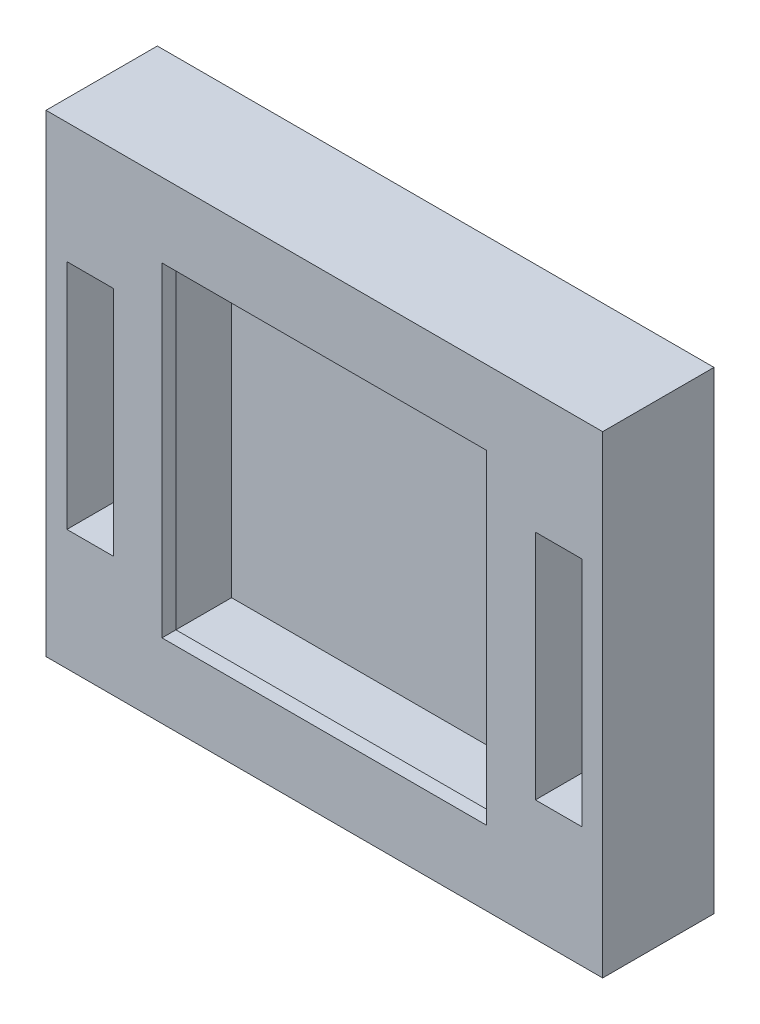
ISO-10303-21;
HEADER;
FILE_DESCRIPTION(('STEP AP214'),'2;1');
FILE_NAME('part.step','',(''),(''),'','','');
FILE_SCHEMA(('AUTOMOTIVE_DESIGN { 1 0 10303 214 1 1 1 1 }'));
ENDSEC;
DATA;
#1=APPLICATION_CONTEXT('core data for automotive mechanical design processes');
#2=APPLICATION_PROTOCOL_DEFINITION('international standard','automotive_design',2000,#1);
#3=PRODUCT_CONTEXT('',#1,'mechanical');
#4=PRODUCT('Part','Part','',(#3));
#5=PRODUCT_RELATED_PRODUCT_CATEGORY('part','',(#4));
#6=PRODUCT_DEFINITION_FORMATION('','',#4);
#7=PRODUCT_DEFINITION_CONTEXT('part definition',#1,'design');
#8=PRODUCT_DEFINITION('design','',#6,#7);
#9=PRODUCT_DEFINITION_SHAPE('','',#8);
#10=(LENGTH_UNIT() NAMED_UNIT(*) SI_UNIT(.MILLI.,.METRE.));
#11=(NAMED_UNIT(*) PLANE_ANGLE_UNIT() SI_UNIT($,.RADIAN.));
#12=(NAMED_UNIT(*) SI_UNIT($,.STERADIAN.) SOLID_ANGLE_UNIT());
#13=UNCERTAINTY_MEASURE_WITH_UNIT(LENGTH_MEASURE(1.E-05),#10,'distance_accuracy_value','');
#14=(GEOMETRIC_REPRESENTATION_CONTEXT(3) GLOBAL_UNCERTAINTY_ASSIGNED_CONTEXT((#13)) GLOBAL_UNIT_ASSIGNED_CONTEXT((#10,
#11,#12)) REPRESENTATION_CONTEXT('',''));
#15=CARTESIAN_POINT('',(0.,0.,0.));
#16=DIRECTION('',(0.,0.,1.));
#17=DIRECTION('',(1.,0.,0.));
#18=AXIS2_PLACEMENT_3D('',#15,#16,#17);
#19=CARTESIAN_POINT('',(15.24,-12.954,5.334));
#20=DIRECTION('',(-1.,0.,0.));
#21=DIRECTION('',(0.,0.,1.));
#22=AXIS2_PLACEMENT_3D('',#19,#20,#21);
#23=PLANE('',#22);
#24=DIRECTION('',(0.,1.,0.));
#25=VECTOR('',#24,1.);
#26=CARTESIAN_POINT('',(15.24,-12.954,0.));
#27=LINE('',#26,#25);
#28=CARTESIAN_POINT('',(15.24,-12.954,0.));
#29=VERTEX_POINT('',#28);
#30=CARTESIAN_POINT('',(15.24,12.954,0.));
#31=VERTEX_POINT('',#30);
#32=EDGE_CURVE('E310',#29,#31,#27,.T.);
#33=ORIENTED_EDGE('',*,*,#32,.T.);
#34=DIRECTION('',(0.,0.,-1.));
#35=VECTOR('',#34,1.);
#36=CARTESIAN_POINT('',(15.24,12.954,5.334));
#37=LINE('',#36,#35);
#38=CARTESIAN_POINT('',(15.24,12.954,6.096));
#39=VERTEX_POINT('',#38);
#40=EDGE_CURVE('E11',#39,#31,#37,.T.);
#41=ORIENTED_EDGE('',*,*,#40,.F.);
#42=DIRECTION('',(0.,1.,0.));
#43=VECTOR('',#42,1.);
#44=CARTESIAN_POINT('',(15.24,12.954,6.096));
#45=LINE('',#44,#43);
#46=CARTESIAN_POINT('',(15.24,-12.954,6.096));
#47=VERTEX_POINT('',#46);
#48=EDGE_CURVE('E276',#47,#39,#45,.T.);
#49=ORIENTED_EDGE('',*,*,#48,.F.);
#50=DIRECTION('',(0.,0.,-1.));
#51=VECTOR('',#50,1.);
#52=CARTESIAN_POINT('',(15.24,-12.954,5.334));
#53=LINE('',#52,#51);
#54=EDGE_CURVE('E327',#47,#29,#53,.T.);
#55=ORIENTED_EDGE('',*,*,#54,.T.);
#56=EDGE_LOOP('',(#33,#41,#49,#55));
#57=FACE_BOUND('',#56,.T.);
#58=ADVANCED_FACE('F33',(#57),#23,.F.);
#59=CARTESIAN_POINT('',(-15.24,12.954,5.334));
#60=DIRECTION('',(0.,-1.,0.));
#61=DIRECTION('',(0.,0.,-1.));
#62=AXIS2_PLACEMENT_3D('',#59,#60,#61);
#63=PLANE('',#62);
#64=DIRECTION('',(-1.,0.,0.));
#65=VECTOR('',#64,1.);
#66=CARTESIAN_POINT('',(-15.24,12.954,0.));
#67=LINE('',#66,#65);
#68=CARTESIAN_POINT('',(-15.24,12.954,0.));
#69=VERTEX_POINT('',#68);
#70=EDGE_CURVE('E321',#31,#69,#67,.T.);
#71=ORIENTED_EDGE('',*,*,#70,.T.);
#72=DIRECTION('',(0.,0.,-1.));
#73=VECTOR('',#72,1.);
#74=CARTESIAN_POINT('',(-15.24,12.954,5.334));
#75=LINE('',#74,#73);
#76=CARTESIAN_POINT('',(-15.24,12.954,6.096));
#77=VERTEX_POINT('',#76);
#78=EDGE_CURVE('E40',#77,#69,#75,.T.);
#79=ORIENTED_EDGE('',*,*,#78,.F.);
#80=DIRECTION('',(-1.,0.,0.));
#81=VECTOR('',#80,1.);
#82=CARTESIAN_POINT('',(-15.24,12.954,6.096));
#83=LINE('',#82,#81);
#84=EDGE_CURVE('E279',#39,#77,#83,.T.);
#85=ORIENTED_EDGE('',*,*,#84,.F.);
#86=ORIENTED_EDGE('',*,*,#40,.T.);
#87=EDGE_LOOP('',(#71,#79,#85,#86));
#88=FACE_BOUND('',#87,.T.);
#89=ADVANCED_FACE('F350',(#88),#63,.F.);
#90=CARTESIAN_POINT('',(-15.24,-12.954,5.334));
#91=DIRECTION('',(1.,0.,0.));
#92=DIRECTION('',(0.,0.,-1.));
#93=AXIS2_PLACEMENT_3D('',#90,#91,#92);
#94=PLANE('',#93);
#95=DIRECTION('',(0.,-1.,0.));
#96=VECTOR('',#95,1.);
#97=CARTESIAN_POINT('',(-15.24,-12.954,0.));
#98=LINE('',#97,#96);
#99=CARTESIAN_POINT('',(-15.24,-12.954,0.));
#100=VERTEX_POINT('',#99);
#101=EDGE_CURVE('E323',#69,#100,#98,.T.);
#102=ORIENTED_EDGE('',*,*,#101,.T.);
#103=DIRECTION('',(0.,0.,-1.));
#104=VECTOR('',#103,1.);
#105=CARTESIAN_POINT('',(-15.24,-12.954,5.334));
#106=LINE('',#105,#104);
#107=CARTESIAN_POINT('',(-15.24,-12.954,6.096));
#108=VERTEX_POINT('',#107);
#109=EDGE_CURVE('E330',#108,#100,#106,.T.);
#110=ORIENTED_EDGE('',*,*,#109,.F.);
#111=DIRECTION('',(0.,-1.,0.));
#112=VECTOR('',#111,1.);
#113=CARTESIAN_POINT('',(-15.24,12.954,6.096));
#114=LINE('',#113,#112);
#115=EDGE_CURVE('E270',#77,#108,#114,.T.);
#116=ORIENTED_EDGE('',*,*,#115,.F.);
#117=ORIENTED_EDGE('',*,*,#78,.T.);
#118=EDGE_LOOP('',(#102,#110,#116,#117));
#119=FACE_BOUND('',#118,.T.);
#120=ADVANCED_FACE('F336',(#119),#94,.F.);
#121=CARTESIAN_POINT('',(-15.24,-12.954,5.334));
#122=DIRECTION('',(0.,1.,0.));
#123=DIRECTION('',(0.,0.,1.));
#124=AXIS2_PLACEMENT_3D('',#121,#122,#123);
#125=PLANE('',#124);
#126=DIRECTION('',(1.,0.,0.));
#127=VECTOR('',#126,1.);
#128=CARTESIAN_POINT('',(-15.24,-12.954,0.));
#129=LINE('',#128,#127);
#130=EDGE_CURVE('E325',#100,#29,#129,.T.);
#131=ORIENTED_EDGE('',*,*,#130,.T.);
#132=ORIENTED_EDGE('',*,*,#54,.F.);
#133=DIRECTION('',(1.,0.,0.));
#134=VECTOR('',#133,1.);
#135=CARTESIAN_POINT('',(-15.24,-12.954,6.096));
#136=LINE('',#135,#134);
#137=EDGE_CURVE('E273',#108,#47,#136,.T.);
#138=ORIENTED_EDGE('',*,*,#137,.F.);
#139=ORIENTED_EDGE('',*,*,#109,.T.);
#140=EDGE_LOOP('',(#131,#132,#138,#139));
#141=FACE_BOUND('',#140,.T.);
#142=ADVANCED_FACE('F343',(#141),#125,.F.);
#143=CARTESIAN_POINT('',(0.,0.,0.));
#144=DIRECTION('',(0.,0.,-1.));
#145=DIRECTION('',(-1.,0.,0.));
#146=AXIS2_PLACEMENT_3D('',#143,#144,#145);
#147=PLANE('',#146);
#148=DIRECTION('',(0.,-1.,0.));
#149=VECTOR('',#148,1.);
#150=CARTESIAN_POINT('',(-14.097,-6.35,0.));
#151=LINE('',#150,#149);
#152=CARTESIAN_POINT('',(-14.097,6.35,0.));
#153=VERTEX_POINT('',#152);
#154=CARTESIAN_POINT('',(-14.097,-6.35,0.));
#155=VERTEX_POINT('',#154);
#156=EDGE_CURVE('E173',#153,#155,#151,.T.);
#157=ORIENTED_EDGE('',*,*,#156,.T.);
#158=DIRECTION('',(1.,0.,0.));
#159=VECTOR('',#158,1.);
#160=CARTESIAN_POINT('',(-11.557,-6.35,0.));
#161=LINE('',#160,#159);
#162=CARTESIAN_POINT('',(-11.557,-6.35,0.));
#163=VERTEX_POINT('',#162);
#164=EDGE_CURVE('E184',#155,#163,#161,.T.);
#165=ORIENTED_EDGE('',*,*,#164,.T.);
#166=DIRECTION('',(0.,1.,0.));
#167=VECTOR('',#166,1.);
#168=CARTESIAN_POINT('',(-11.557,-6.35,0.));
#169=LINE('',#168,#167);
#170=CARTESIAN_POINT('',(-11.557,6.35,0.));
#171=VERTEX_POINT('',#170);
#172=EDGE_CURVE('E47',#163,#171,#169,.T.);
#173=ORIENTED_EDGE('',*,*,#172,.T.);
#174=DIRECTION('',(-1.,0.,0.));
#175=VECTOR('',#174,1.);
#176=CARTESIAN_POINT('',(-11.557,6.35,0.));
#177=LINE('',#176,#175);
#178=EDGE_CURVE('E181',#171,#153,#177,.T.);
#179=ORIENTED_EDGE('',*,*,#178,.T.);
#180=EDGE_LOOP('',(#157,#165,#173,#179));
#181=FACE_BOUND('',#180,.T.);
#182=DIRECTION('',(0.,-1.,0.));
#183=VECTOR('',#182,1.);
#184=CARTESIAN_POINT('',(11.557,-6.35,0.));
#185=LINE('',#184,#183);
#186=CARTESIAN_POINT('',(11.557,6.35,0.));
#187=VERTEX_POINT('',#186);
#188=CARTESIAN_POINT('',(11.557,-6.35,0.));
#189=VERTEX_POINT('',#188);
#190=EDGE_CURVE('E211',#187,#189,#185,.T.);
#191=ORIENTED_EDGE('',*,*,#190,.T.);
#192=DIRECTION('',(1.,0.,0.));
#193=VECTOR('',#192,1.);
#194=CARTESIAN_POINT('',(11.557,-6.35,0.));
#195=LINE('',#194,#193);
#196=CARTESIAN_POINT('',(14.097,-6.35,0.));
#197=VERTEX_POINT('',#196);
#198=EDGE_CURVE('E214',#189,#197,#195,.T.);
#199=ORIENTED_EDGE('',*,*,#198,.T.);
#200=DIRECTION('',(0.,1.,0.));
#201=VECTOR('',#200,1.);
#202=CARTESIAN_POINT('',(14.097,-6.35,0.));
#203=LINE('',#202,#201);
#204=CARTESIAN_POINT('',(14.097,6.35,0.));
#205=VERTEX_POINT('',#204);
#206=EDGE_CURVE('E55',#197,#205,#203,.T.);
#207=ORIENTED_EDGE('',*,*,#206,.T.);
#208=DIRECTION('',(-1.,0.,0.));
#209=VECTOR('',#208,1.);
#210=CARTESIAN_POINT('',(11.557,6.35,0.));
#211=LINE('',#210,#209);
#212=EDGE_CURVE('E219',#205,#187,#211,.T.);
#213=ORIENTED_EDGE('',*,*,#212,.T.);
#214=EDGE_LOOP('',(#191,#199,#207,#213));
#215=FACE_BOUND('',#214,.T.);
#216=ORIENTED_EDGE('',*,*,#32,.F.);
#217=ORIENTED_EDGE('',*,*,#130,.F.);
#218=ORIENTED_EDGE('',*,*,#101,.F.);
#219=ORIENTED_EDGE('',*,*,#70,.F.);
#220=EDGE_LOOP('',(#216,#217,#218,#219));
#221=FACE_BOUND('',#220,.T.);
#222=ADVANCED_FACE('F188',(#181,#215,#221),#147,.T.);
#223=CARTESIAN_POINT('',(0.,0.,6.096));
#224=DIRECTION('',(0.,0.,1.));
#225=DIRECTION('',(1.,0.,0.));
#226=AXIS2_PLACEMENT_3D('',#223,#224,#225);
#227=PLANE('',#226);
#228=DIRECTION('',(0.,-1.,0.));
#229=VECTOR('',#228,1.);
#230=CARTESIAN_POINT('',(-14.097,-6.35,6.096));
#231=LINE('',#230,#229);
#232=CARTESIAN_POINT('',(-14.097,6.35,6.096));
#233=VERTEX_POINT('',#232);
#234=CARTESIAN_POINT('',(-14.097,-6.35,6.096));
#235=VERTEX_POINT('',#234);
#236=EDGE_CURVE('E176',#233,#235,#231,.T.);
#237=ORIENTED_EDGE('',*,*,#236,.F.);
#238=DIRECTION('',(-1.,0.,0.));
#239=VECTOR('',#238,1.);
#240=CARTESIAN_POINT('',(-11.557,6.35,6.096));
#241=LINE('',#240,#239);
#242=CARTESIAN_POINT('',(-11.557,6.35,6.096));
#243=VERTEX_POINT('',#242);
#244=EDGE_CURVE('E191',#243,#233,#241,.T.);
#245=ORIENTED_EDGE('',*,*,#244,.F.);
#246=DIRECTION('',(0.,1.,0.));
#247=VECTOR('',#246,1.);
#248=CARTESIAN_POINT('',(-11.557,-6.35,6.096));
#249=LINE('',#248,#247);
#250=CARTESIAN_POINT('',(-11.557,-6.35,6.096));
#251=VERTEX_POINT('',#250);
#252=EDGE_CURVE('E194',#251,#243,#249,.T.);
#253=ORIENTED_EDGE('',*,*,#252,.F.);
#254=DIRECTION('',(1.,0.,0.));
#255=VECTOR('',#254,1.);
#256=CARTESIAN_POINT('',(-11.557,-6.35,6.096));
#257=LINE('',#256,#255);
#258=EDGE_CURVE('E200',#235,#251,#257,.T.);
#259=ORIENTED_EDGE('',*,*,#258,.F.);
#260=EDGE_LOOP('',(#237,#245,#253,#259));
#261=FACE_BOUND('',#260,.T.);
#262=DIRECTION('',(0.,-1.,0.));
#263=VECTOR('',#262,1.);
#264=CARTESIAN_POINT('',(11.557,-6.35,6.096));
#265=LINE('',#264,#263);
#266=CARTESIAN_POINT('',(11.557,6.35,6.096));
#267=VERTEX_POINT('',#266);
#268=CARTESIAN_POINT('',(11.557,-6.35,6.096));
#269=VERTEX_POINT('',#268);
#270=EDGE_CURVE('E223',#267,#269,#265,.T.);
#271=ORIENTED_EDGE('',*,*,#270,.F.);
#272=DIRECTION('',(-1.,0.,0.));
#273=VECTOR('',#272,1.);
#274=CARTESIAN_POINT('',(11.557,6.35,6.096));
#275=LINE('',#274,#273);
#276=CARTESIAN_POINT('',(14.097,6.35,6.096));
#277=VERTEX_POINT('',#276);
#278=EDGE_CURVE('E215',#277,#267,#275,.T.);
#279=ORIENTED_EDGE('',*,*,#278,.F.);
#280=DIRECTION('',(0.,1.,0.));
#281=VECTOR('',#280,1.);
#282=CARTESIAN_POINT('',(14.097,-6.35,6.096));
#283=LINE('',#282,#281);
#284=CARTESIAN_POINT('',(14.097,-6.35,6.096));
#285=VERTEX_POINT('',#284);
#286=EDGE_CURVE('E228',#285,#277,#283,.T.);
#287=ORIENTED_EDGE('',*,*,#286,.F.);
#288=DIRECTION('',(1.,0.,0.));
#289=VECTOR('',#288,1.);
#290=CARTESIAN_POINT('',(11.557,-6.35,6.096));
#291=LINE('',#290,#289);
#292=EDGE_CURVE('E225',#269,#285,#291,.T.);
#293=ORIENTED_EDGE('',*,*,#292,.F.);
#294=EDGE_LOOP('',(#271,#279,#287,#293));
#295=FACE_BOUND('',#294,.T.);
#296=ORIENTED_EDGE('',*,*,#115,.T.);
#297=ORIENTED_EDGE('',*,*,#137,.T.);
#298=ORIENTED_EDGE('',*,*,#48,.T.);
#299=ORIENTED_EDGE('',*,*,#84,.T.);
#300=EDGE_LOOP('',(#296,#297,#298,#299));
#301=FACE_BOUND('',#300,.T.);
#302=DIRECTION('',(1.,0.,0.));
#303=VECTOR('',#302,1.);
#304=CARTESIAN_POINT('',(8.89,-8.89,6.096));
#305=LINE('',#304,#303);
#306=CARTESIAN_POINT('',(-8.89,-8.89,6.096));
#307=VERTEX_POINT('',#306);
#308=CARTESIAN_POINT('',(8.89,-8.89,6.096));
#309=VERTEX_POINT('',#308);
#310=EDGE_CURVE('E242',#307,#309,#305,.T.);
#311=ORIENTED_EDGE('',*,*,#310,.F.);
#312=DIRECTION('',(0.,-1.,0.));
#313=VECTOR('',#312,1.);
#314=CARTESIAN_POINT('',(-8.89,-8.89,6.096));
#315=LINE('',#314,#313);
#316=CARTESIAN_POINT('',(-8.89,8.89,6.096));
#317=VERTEX_POINT('',#316);
#318=EDGE_CURVE('E240',#317,#307,#315,.T.);
#319=ORIENTED_EDGE('',*,*,#318,.F.);
#320=DIRECTION('',(-1.,0.,0.));
#321=VECTOR('',#320,1.);
#322=CARTESIAN_POINT('',(8.89,8.89,6.096));
#323=LINE('',#322,#321);
#324=CARTESIAN_POINT('',(8.89,8.89,6.096));
#325=VERTEX_POINT('',#324);
#326=EDGE_CURVE('E248',#325,#317,#323,.T.);
#327=ORIENTED_EDGE('',*,*,#326,.F.);
#328=DIRECTION('',(0.,1.,0.));
#329=VECTOR('',#328,1.);
#330=CARTESIAN_POINT('',(8.89,-8.89,6.096));
#331=LINE('',#330,#329);
#332=EDGE_CURVE('E245',#309,#325,#331,.T.);
#333=ORIENTED_EDGE('',*,*,#332,.F.);
#334=EDGE_LOOP('',(#311,#319,#327,#333));
#335=FACE_BOUND('',#334,.T.);
#336=ADVANCED_FACE('F348',(#261,#295,#301,#335),#227,.T.);
#337=CARTESIAN_POINT('',(0.,0.,5.334));
#338=DIRECTION('',(0.,0.,1.));
#339=DIRECTION('',(1.,0.,0.));
#340=AXIS2_PLACEMENT_3D('',#337,#338,#339);
#341=PLANE('',#340);
#342=DIRECTION('',(-1.,0.,0.));
#343=VECTOR('',#342,1.);
#344=CARTESIAN_POINT('',(-10.414,10.414,5.334));
#345=LINE('',#344,#343);
#346=CARTESIAN_POINT('',(10.414,10.414,5.334));
#347=VERTEX_POINT('',#346);
#348=CARTESIAN_POINT('',(-10.414,10.414,5.334));
#349=VERTEX_POINT('',#348);
#350=EDGE_CURVE('E299',#347,#349,#345,.T.);
#351=ORIENTED_EDGE('',*,*,#350,.F.);
#352=DIRECTION('',(0.,1.,0.));
#353=VECTOR('',#352,1.);
#354=CARTESIAN_POINT('',(10.414,-10.414,5.334));
#355=LINE('',#354,#353);
#356=CARTESIAN_POINT('',(10.414,-10.414,5.334));
#357=VERTEX_POINT('',#356);
#358=EDGE_CURVE('E282',#357,#347,#355,.T.);
#359=ORIENTED_EDGE('',*,*,#358,.F.);
#360=DIRECTION('',(1.,0.,0.));
#361=VECTOR('',#360,1.);
#362=CARTESIAN_POINT('',(-10.414,-10.414,5.334));
#363=LINE('',#362,#361);
#364=CARTESIAN_POINT('',(-10.414,-10.414,5.334));
#365=VERTEX_POINT('',#364);
#366=EDGE_CURVE('E287',#365,#357,#363,.T.);
#367=ORIENTED_EDGE('',*,*,#366,.F.);
#368=DIRECTION('',(0.,-1.,0.));
#369=VECTOR('',#368,1.);
#370=CARTESIAN_POINT('',(-10.414,-10.414,5.334));
#371=LINE('',#370,#369);
#372=EDGE_CURVE('E302',#349,#365,#371,.T.);
#373=ORIENTED_EDGE('',*,*,#372,.F.);
#374=EDGE_LOOP('',(#351,#359,#367,#373));
#375=FACE_BOUND('',#374,.T.);
#376=DIRECTION('',(0.,-1.,0.));
#377=VECTOR('',#376,1.);
#378=CARTESIAN_POINT('',(-8.89,-8.89,5.334));
#379=LINE('',#378,#377);
#380=CARTESIAN_POINT('',(-8.89,8.89,5.334));
#381=VERTEX_POINT('',#380);
#382=CARTESIAN_POINT('',(-8.89,-8.89,5.334));
#383=VERTEX_POINT('',#382);
#384=EDGE_CURVE('E207',#381,#383,#379,.T.);
#385=ORIENTED_EDGE('',*,*,#384,.T.);
#386=DIRECTION('',(1.,0.,0.));
#387=VECTOR('',#386,1.);
#388=CARTESIAN_POINT('',(8.89,-8.89,5.334));
#389=LINE('',#388,#387);
#390=CARTESIAN_POINT('',(8.89,-8.89,5.334));
#391=VERTEX_POINT('',#390);
#392=EDGE_CURVE('E253',#383,#391,#389,.T.);
#393=ORIENTED_EDGE('',*,*,#392,.T.);
#394=DIRECTION('',(0.,1.,0.));
#395=VECTOR('',#394,1.);
#396=CARTESIAN_POINT('',(8.89,-8.89,5.334));
#397=LINE('',#396,#395);
#398=CARTESIAN_POINT('',(8.89,8.89,5.334));
#399=VERTEX_POINT('',#398);
#400=EDGE_CURVE('E256',#391,#399,#397,.T.);
#401=ORIENTED_EDGE('',*,*,#400,.T.);
#402=DIRECTION('',(-1.,0.,0.));
#403=VECTOR('',#402,1.);
#404=CARTESIAN_POINT('',(8.89,8.89,5.334));
#405=LINE('',#404,#403);
#406=EDGE_CURVE('E243',#399,#381,#405,.T.);
#407=ORIENTED_EDGE('',*,*,#406,.T.);
#408=EDGE_LOOP('',(#385,#393,#401,#407));
#409=FACE_BOUND('',#408,.T.);
#410=ADVANCED_FACE('F384',(#375,#409),#341,.F.);
#411=CARTESIAN_POINT('',(-8.89,-8.89,6.096));
#412=DIRECTION('',(1.,0.,0.));
#413=DIRECTION('',(0.,0.,-1.));
#414=AXIS2_PLACEMENT_3D('',#411,#412,#413);
#415=PLANE('',#414);
#416=ORIENTED_EDGE('',*,*,#384,.F.);
#417=DIRECTION('',(0.,0.,-1.));
#418=VECTOR('',#417,1.);
#419=CARTESIAN_POINT('',(-8.89,8.89,6.096));
#420=LINE('',#419,#418);
#421=EDGE_CURVE('E250',#317,#381,#420,.T.);
#422=ORIENTED_EDGE('',*,*,#421,.F.);
#423=ORIENTED_EDGE('',*,*,#318,.T.);
#424=DIRECTION('',(0.,0.,-1.));
#425=VECTOR('',#424,1.);
#426=CARTESIAN_POINT('',(-8.89,-8.89,6.096));
#427=LINE('',#426,#425);
#428=EDGE_CURVE('E267',#307,#383,#427,.T.);
#429=ORIENTED_EDGE('',*,*,#428,.T.);
#430=EDGE_LOOP('',(#416,#422,#423,#429));
#431=FACE_BOUND('',#430,.T.);
#432=ADVANCED_FACE('F387',(#431),#415,.T.);
#433=CARTESIAN_POINT('',(8.89,-8.89,6.096));
#434=DIRECTION('',(0.,1.,0.));
#435=DIRECTION('',(-1.,0.,0.));
#436=AXIS2_PLACEMENT_3D('',#433,#434,#435);
#437=PLANE('',#436);
#438=ORIENTED_EDGE('',*,*,#392,.F.);
#439=ORIENTED_EDGE('',*,*,#428,.F.);
#440=ORIENTED_EDGE('',*,*,#310,.T.);
#441=DIRECTION('',(0.,0.,-1.));
#442=VECTOR('',#441,1.);
#443=CARTESIAN_POINT('',(8.89,-8.89,6.096));
#444=LINE('',#443,#442);
#445=EDGE_CURVE('E265',#309,#391,#444,.T.);
#446=ORIENTED_EDGE('',*,*,#445,.T.);
#447=EDGE_LOOP('',(#438,#439,#440,#446));
#448=FACE_BOUND('',#447,.T.);
#449=ADVANCED_FACE('F394',(#448),#437,.T.);
#450=CARTESIAN_POINT('',(8.89,-8.89,6.096));
#451=DIRECTION('',(-1.,0.,0.));
#452=DIRECTION('',(0.,0.,1.));
#453=AXIS2_PLACEMENT_3D('',#450,#451,#452);
#454=PLANE('',#453);
#455=ORIENTED_EDGE('',*,*,#400,.F.);
#456=ORIENTED_EDGE('',*,*,#445,.F.);
#457=ORIENTED_EDGE('',*,*,#332,.T.);
#458=DIRECTION('',(0.,0.,-1.));
#459=VECTOR('',#458,1.);
#460=CARTESIAN_POINT('',(8.89,8.89,6.096));
#461=LINE('',#460,#459);
#462=EDGE_CURVE('E263',#325,#399,#461,.T.);
#463=ORIENTED_EDGE('',*,*,#462,.T.);
#464=EDGE_LOOP('',(#455,#456,#457,#463));
#465=FACE_BOUND('',#464,.T.);
#466=ADVANCED_FACE('F398',(#465),#454,.T.);
#467=CARTESIAN_POINT('',(8.89,8.89,6.096));
#468=DIRECTION('',(0.,-1.,0.));
#469=DIRECTION('',(1.,0.,0.));
#470=AXIS2_PLACEMENT_3D('',#467,#468,#469);
#471=PLANE('',#470);
#472=ORIENTED_EDGE('',*,*,#406,.F.);
#473=ORIENTED_EDGE('',*,*,#462,.F.);
#474=ORIENTED_EDGE('',*,*,#326,.T.);
#475=ORIENTED_EDGE('',*,*,#421,.T.);
#476=EDGE_LOOP('',(#472,#473,#474,#475));
#477=FACE_BOUND('',#476,.T.);
#478=ADVANCED_FACE('F382',(#477),#471,.T.);
#479=CARTESIAN_POINT('',(0.,0.,0.762));
#480=DIRECTION('',(0.,0.,-1.));
#481=DIRECTION('',(-1.,0.,0.));
#482=AXIS2_PLACEMENT_3D('',#479,#480,#481);
#483=PLANE('',#482);
#484=DIRECTION('',(0.,1.,0.));
#485=VECTOR('',#484,1.);
#486=CARTESIAN_POINT('',(10.414,-10.414,0.762));
#487=LINE('',#486,#485);
#488=CARTESIAN_POINT('',(10.414,-10.414,0.762));
#489=VERTEX_POINT('',#488);
#490=CARTESIAN_POINT('',(10.414,10.414,0.762));
#491=VERTEX_POINT('',#490);
#492=EDGE_CURVE('E283',#489,#491,#487,.T.);
#493=ORIENTED_EDGE('',*,*,#492,.T.);
#494=DIRECTION('',(-1.,0.,0.));
#495=VECTOR('',#494,1.);
#496=CARTESIAN_POINT('',(-10.414,10.414,0.762));
#497=LINE('',#496,#495);
#498=CARTESIAN_POINT('',(-10.414,10.414,0.762));
#499=VERTEX_POINT('',#498);
#500=EDGE_CURVE('E286',#491,#499,#497,.T.);
#501=ORIENTED_EDGE('',*,*,#500,.T.);
#502=DIRECTION('',(0.,-1.,0.));
#503=VECTOR('',#502,1.);
#504=CARTESIAN_POINT('',(-10.414,-10.414,0.762));
#505=LINE('',#504,#503);
#506=CARTESIAN_POINT('',(-10.414,-10.414,0.762));
#507=VERTEX_POINT('',#506);
#508=EDGE_CURVE('E290',#499,#507,#505,.T.);
#509=ORIENTED_EDGE('',*,*,#508,.T.);
#510=DIRECTION('',(1.,0.,0.));
#511=VECTOR('',#510,1.);
#512=CARTESIAN_POINT('',(-10.414,-10.414,0.762));
#513=LINE('',#512,#511);
#514=EDGE_CURVE('E293',#507,#489,#513,.T.);
#515=ORIENTED_EDGE('',*,*,#514,.T.);
#516=EDGE_LOOP('',(#493,#501,#509,#515));
#517=FACE_BOUND('',#516,.T.);
#518=ADVANCED_FACE('F375',(#517),#483,.F.);
#519=CARTESIAN_POINT('',(-10.414,-10.414,0.762));
#520=DIRECTION('',(-1.,0.,0.));
#521=DIRECTION('',(0.,0.,1.));
#522=AXIS2_PLACEMENT_3D('',#519,#520,#521);
#523=PLANE('',#522);
#524=ORIENTED_EDGE('',*,*,#372,.T.);
#525=DIRECTION('',(0.,0.,1.));
#526=VECTOR('',#525,1.);
#527=CARTESIAN_POINT('',(-10.414,-10.414,0.762));
#528=LINE('',#527,#526);
#529=EDGE_CURVE('E311',#507,#365,#528,.T.);
#530=ORIENTED_EDGE('',*,*,#529,.F.);
#531=ORIENTED_EDGE('',*,*,#508,.F.);
#532=DIRECTION('',(0.,0.,1.));
#533=VECTOR('',#532,1.);
#534=CARTESIAN_POINT('',(-10.414,10.414,0.762));
#535=LINE('',#534,#533);
#536=EDGE_CURVE('E314',#499,#349,#535,.T.);
#537=ORIENTED_EDGE('',*,*,#536,.T.);
#538=EDGE_LOOP('',(#524,#530,#531,#537));
#539=FACE_BOUND('',#538,.T.);
#540=ADVANCED_FACE('F372',(#539),#523,.F.);
#541=CARTESIAN_POINT('',(-10.414,-10.414,0.762));
#542=DIRECTION('',(0.,-1.,0.));
#543=DIRECTION('',(0.,0.,-1.));
#544=AXIS2_PLACEMENT_3D('',#541,#542,#543);
#545=PLANE('',#544);
#546=ORIENTED_EDGE('',*,*,#366,.T.);
#547=DIRECTION('',(0.,0.,1.));
#548=VECTOR('',#547,1.);
#549=CARTESIAN_POINT('',(10.414,-10.414,0.762));
#550=LINE('',#549,#548);
#551=EDGE_CURVE('E307',#489,#357,#550,.T.);
#552=ORIENTED_EDGE('',*,*,#551,.F.);
#553=ORIENTED_EDGE('',*,*,#514,.F.);
#554=ORIENTED_EDGE('',*,*,#529,.T.);
#555=EDGE_LOOP('',(#546,#552,#553,#554));
#556=FACE_BOUND('',#555,.T.);
#557=ADVANCED_FACE('F366',(#556),#545,.F.);
#558=CARTESIAN_POINT('',(10.414,-10.414,0.762));
#559=DIRECTION('',(1.,0.,0.));
#560=DIRECTION('',(0.,0.,-1.));
#561=AXIS2_PLACEMENT_3D('',#558,#559,#560);
#562=PLANE('',#561);
#563=ORIENTED_EDGE('',*,*,#358,.T.);
#564=DIRECTION('',(0.,0.,1.));
#565=VECTOR('',#564,1.);
#566=CARTESIAN_POINT('',(10.414,10.414,0.762));
#567=LINE('',#566,#565);
#568=EDGE_CURVE('E296',#491,#347,#567,.T.);
#569=ORIENTED_EDGE('',*,*,#568,.F.);
#570=ORIENTED_EDGE('',*,*,#492,.F.);
#571=ORIENTED_EDGE('',*,*,#551,.T.);
#572=EDGE_LOOP('',(#563,#569,#570,#571));
#573=FACE_BOUND('',#572,.T.);
#574=ADVANCED_FACE('F362',(#573),#562,.F.);
#575=CARTESIAN_POINT('',(-10.414,10.414,0.762));
#576=DIRECTION('',(0.,1.,0.));
#577=DIRECTION('',(0.,0.,1.));
#578=AXIS2_PLACEMENT_3D('',#575,#576,#577);
#579=PLANE('',#578);
#580=ORIENTED_EDGE('',*,*,#350,.T.);
#581=ORIENTED_EDGE('',*,*,#536,.F.);
#582=ORIENTED_EDGE('',*,*,#500,.F.);
#583=ORIENTED_EDGE('',*,*,#568,.T.);
#584=EDGE_LOOP('',(#580,#581,#582,#583));
#585=FACE_BOUND('',#584,.T.);
#586=ADVANCED_FACE('F365',(#585),#579,.F.);
#587=CARTESIAN_POINT('',(11.557,-6.35,0.));
#588=DIRECTION('',(-1.,0.,0.));
#589=DIRECTION('',(0.,0.,1.));
#590=AXIS2_PLACEMENT_3D('',#587,#588,#589);
#591=PLANE('',#590);
#592=ORIENTED_EDGE('',*,*,#270,.T.);
#593=DIRECTION('',(0.,0.,1.));
#594=VECTOR('',#593,1.);
#595=CARTESIAN_POINT('',(11.557,-6.35,0.));
#596=LINE('',#595,#594);
#597=EDGE_CURVE('E222',#189,#269,#596,.T.);
#598=ORIENTED_EDGE('',*,*,#597,.F.);
#599=ORIENTED_EDGE('',*,*,#190,.F.);
#600=DIRECTION('',(0.,0.,1.));
#601=VECTOR('',#600,1.);
#602=CARTESIAN_POINT('',(11.557,6.35,0.));
#603=LINE('',#602,#601);
#604=EDGE_CURVE('E201',#187,#267,#603,.T.);
#605=ORIENTED_EDGE('',*,*,#604,.T.);
#606=EDGE_LOOP('',(#592,#598,#599,#605));
#607=FACE_BOUND('',#606,.T.);
#608=ADVANCED_FACE('F370',(#607),#591,.F.);
#609=CARTESIAN_POINT('',(11.557,6.35,0.));
#610=DIRECTION('',(0.,1.,0.));
#611=DIRECTION('',(0.,0.,1.));
#612=AXIS2_PLACEMENT_3D('',#609,#610,#611);
#613=PLANE('',#612);
#614=ORIENTED_EDGE('',*,*,#278,.T.);
#615=ORIENTED_EDGE('',*,*,#604,.F.);
#616=ORIENTED_EDGE('',*,*,#212,.F.);
#617=DIRECTION('',(0.,0.,1.));
#618=VECTOR('',#617,1.);
#619=CARTESIAN_POINT('',(14.097,6.35,0.));
#620=LINE('',#619,#618);
#621=EDGE_CURVE('E234',#205,#277,#620,.T.);
#622=ORIENTED_EDGE('',*,*,#621,.T.);
#623=EDGE_LOOP('',(#614,#615,#616,#622));
#624=FACE_BOUND('',#623,.T.);
#625=ADVANCED_FACE('F408',(#624),#613,.F.);
#626=CARTESIAN_POINT('',(14.097,-6.35,0.));
#627=DIRECTION('',(1.,0.,0.));
#628=DIRECTION('',(0.,0.,-1.));
#629=AXIS2_PLACEMENT_3D('',#626,#627,#628);
#630=PLANE('',#629);
#631=ORIENTED_EDGE('',*,*,#286,.T.);
#632=ORIENTED_EDGE('',*,*,#621,.F.);
#633=ORIENTED_EDGE('',*,*,#206,.F.);
#634=DIRECTION('',(0.,0.,1.));
#635=VECTOR('',#634,1.);
#636=CARTESIAN_POINT('',(14.097,-6.35,0.));
#637=LINE('',#636,#635);
#638=EDGE_CURVE('E236',#197,#285,#637,.T.);
#639=ORIENTED_EDGE('',*,*,#638,.T.);
#640=EDGE_LOOP('',(#631,#632,#633,#639));
#641=FACE_BOUND('',#640,.T.);
#642=ADVANCED_FACE('F413',(#641),#630,.F.);
#643=CARTESIAN_POINT('',(11.557,-6.35,0.));
#644=DIRECTION('',(0.,-1.,0.));
#645=DIRECTION('',(0.,0.,-1.));
#646=AXIS2_PLACEMENT_3D('',#643,#644,#645);
#647=PLANE('',#646);
#648=ORIENTED_EDGE('',*,*,#292,.T.);
#649=ORIENTED_EDGE('',*,*,#638,.F.);
#650=ORIENTED_EDGE('',*,*,#198,.F.);
#651=ORIENTED_EDGE('',*,*,#597,.T.);
#652=EDGE_LOOP('',(#648,#649,#650,#651));
#653=FACE_BOUND('',#652,.T.);
#654=ADVANCED_FACE('F410',(#653),#647,.F.);
#655=CARTESIAN_POINT('',(-14.097,-6.35,0.));
#656=DIRECTION('',(-1.,0.,0.));
#657=DIRECTION('',(0.,0.,1.));
#658=AXIS2_PLACEMENT_3D('',#655,#656,#657);
#659=PLANE('',#658);
#660=ORIENTED_EDGE('',*,*,#236,.T.);
#661=DIRECTION('',(0.,0.,1.));
#662=VECTOR('',#661,1.);
#663=CARTESIAN_POINT('',(-14.097,-6.35,0.));
#664=LINE('',#663,#662);
#665=EDGE_CURVE('E169',#155,#235,#664,.T.);
#666=ORIENTED_EDGE('',*,*,#665,.F.);
#667=ORIENTED_EDGE('',*,*,#156,.F.);
#668=DIRECTION('',(0.,0.,1.));
#669=VECTOR('',#668,1.);
#670=CARTESIAN_POINT('',(-14.097,6.35,0.));
#671=LINE('',#670,#669);
#672=EDGE_CURVE('E205',#153,#233,#671,.T.);
#673=ORIENTED_EDGE('',*,*,#672,.T.);
#674=EDGE_LOOP('',(#660,#666,#667,#673));
#675=FACE_BOUND('',#674,.T.);
#676=ADVANCED_FACE('F171',(#675),#659,.F.);
#677=CARTESIAN_POINT('',(-11.557,6.35,0.));
#678=DIRECTION('',(0.,1.,0.));
#679=DIRECTION('',(0.,0.,1.));
#680=AXIS2_PLACEMENT_3D('',#677,#678,#679);
#681=PLANE('',#680);
#682=ORIENTED_EDGE('',*,*,#244,.T.);
#683=ORIENTED_EDGE('',*,*,#672,.F.);
#684=ORIENTED_EDGE('',*,*,#178,.F.);
#685=DIRECTION('',(0.,0.,1.));
#686=VECTOR('',#685,1.);
#687=CARTESIAN_POINT('',(-11.557,6.35,0.));
#688=LINE('',#687,#686);
#689=EDGE_CURVE('E208',#171,#243,#688,.T.);
#690=ORIENTED_EDGE('',*,*,#689,.T.);
#691=EDGE_LOOP('',(#682,#683,#684,#690));
#692=FACE_BOUND('',#691,.T.);
#693=ADVANCED_FACE('F422',(#692),#681,.F.);
#694=CARTESIAN_POINT('',(-11.557,-6.35,0.));
#695=DIRECTION('',(1.,0.,0.));
#696=DIRECTION('',(0.,0.,-1.));
#697=AXIS2_PLACEMENT_3D('',#694,#695,#696);
#698=PLANE('',#697);
#699=ORIENTED_EDGE('',*,*,#252,.T.);
#700=ORIENTED_EDGE('',*,*,#689,.F.);
#701=ORIENTED_EDGE('',*,*,#172,.F.);
#702=DIRECTION('',(0.,0.,1.));
#703=VECTOR('',#702,1.);
#704=CARTESIAN_POINT('',(-11.557,-6.35,0.));
#705=LINE('',#704,#703);
#706=EDGE_CURVE('E180',#163,#251,#705,.T.);
#707=ORIENTED_EDGE('',*,*,#706,.T.);
#708=EDGE_LOOP('',(#699,#700,#701,#707));
#709=FACE_BOUND('',#708,.T.);
#710=ADVANCED_FACE('F425',(#709),#698,.F.);
#711=CARTESIAN_POINT('',(-11.557,-6.35,0.));
#712=DIRECTION('',(0.,-1.,0.));
#713=DIRECTION('',(0.,0.,-1.));
#714=AXIS2_PLACEMENT_3D('',#711,#712,#713);
#715=PLANE('',#714);
#716=ORIENTED_EDGE('',*,*,#258,.T.);
#717=ORIENTED_EDGE('',*,*,#706,.F.);
#718=ORIENTED_EDGE('',*,*,#164,.F.);
#719=ORIENTED_EDGE('',*,*,#665,.T.);
#720=EDGE_LOOP('',(#716,#717,#718,#719));
#721=FACE_BOUND('',#720,.T.);
#722=ADVANCED_FACE('F185',(#721),#715,.F.);
#723=CLOSED_SHELL('',(#58,#89,#120,#142,#222,#336,#410,#432,#449,#466,#478,#518,#540,#557,#574,
#586,#608,#625,#642,#654,#676,#693,#710,#722));
#724=MANIFOLD_SOLID_BREP('B2',#723);
#725=ADVANCED_BREP_SHAPE_REPRESENTATION('',(#18,#724),#14);
#726=SHAPE_DEFINITION_REPRESENTATION(#9,#725);
ENDSEC;
END-ISO-10303-21;
